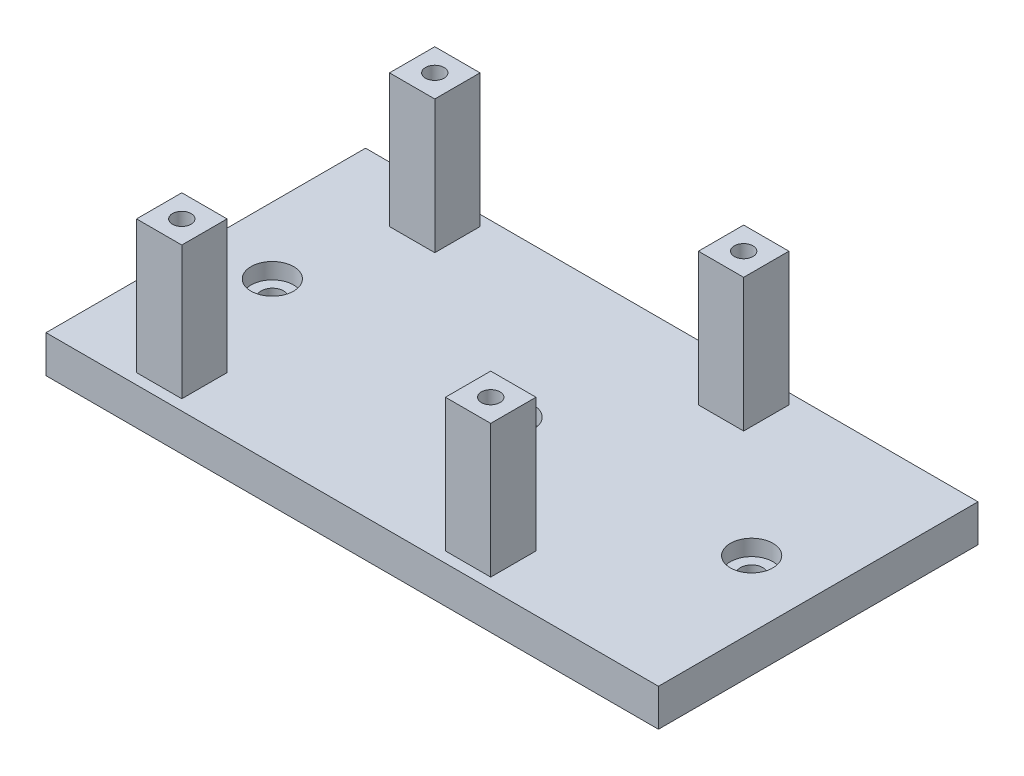
ISO-10303-21;
HEADER;
FILE_DESCRIPTION(('STEP AP214'),'2;1');
FILE_NAME('part.step','',(''),(''),'','','');
FILE_SCHEMA(('AUTOMOTIVE_DESIGN { 1 0 10303 214 1 1 1 1 }'));
ENDSEC;
DATA;
#1=APPLICATION_CONTEXT('core data for automotive mechanical design processes');
#2=APPLICATION_PROTOCOL_DEFINITION('international standard','automotive_design',2000,#1);
#3=PRODUCT_CONTEXT('',#1,'mechanical');
#4=PRODUCT('Part','Part','',(#3));
#5=PRODUCT_RELATED_PRODUCT_CATEGORY('part','',(#4));
#6=PRODUCT_DEFINITION_FORMATION('','',#4);
#7=PRODUCT_DEFINITION_CONTEXT('part definition',#1,'design');
#8=PRODUCT_DEFINITION('design','',#6,#7);
#9=PRODUCT_DEFINITION_SHAPE('','',#8);
#10=(LENGTH_UNIT() NAMED_UNIT(*) SI_UNIT(.MILLI.,.METRE.));
#11=(NAMED_UNIT(*) PLANE_ANGLE_UNIT() SI_UNIT($,.RADIAN.));
#12=(NAMED_UNIT(*) SI_UNIT($,.STERADIAN.) SOLID_ANGLE_UNIT());
#13=UNCERTAINTY_MEASURE_WITH_UNIT(LENGTH_MEASURE(1.E-05),#10,'distance_accuracy_value','');
#14=(GEOMETRIC_REPRESENTATION_CONTEXT(3) GLOBAL_UNCERTAINTY_ASSIGNED_CONTEXT((#13)) GLOBAL_UNIT_ASSIGNED_CONTEXT((#10,
#11,#12)) REPRESENTATION_CONTEXT('',''));
#15=CARTESIAN_POINT('',(0.,0.,0.));
#16=DIRECTION('',(0.,0.,1.));
#17=DIRECTION('',(1.,0.,0.));
#18=AXIS2_PLACEMENT_3D('',#15,#16,#17);
#19=CARTESIAN_POINT('',(0.,7.,0.));
#20=DIRECTION('',(0.,-1.,0.));
#21=DIRECTION('',(0.,0.,-1.));
#22=AXIS2_PLACEMENT_3D('',#19,#20,#21);
#23=PLANE('',#22);
#24=DIRECTION('',(-1.,0.,0.));
#25=VECTOR('',#24,1.);
#26=CARTESIAN_POINT('',(0.,7.,-10.5));
#27=LINE('',#26,#25);
#28=CARTESIAN_POINT('',(23.5,7.,-10.5));
#29=VERTEX_POINT('',#28);
#30=CARTESIAN_POINT('',(15.,7.,-10.5));
#31=VERTEX_POINT('',#30);
#32=EDGE_CURVE('E260',#29,#31,#27,.T.);
#33=ORIENTED_EDGE('',*,*,#32,.F.);
#34=DIRECTION('',(0.,0.,-1.));
#35=VECTOR('',#34,1.);
#36=CARTESIAN_POINT('',(23.5,7.,0.));
#37=LINE('',#36,#35);
#38=CARTESIAN_POINT('',(23.5,7.,-1.99999999999999));
#39=VERTEX_POINT('',#38);
#40=EDGE_CURVE('E266',#39,#29,#37,.T.);
#41=ORIENTED_EDGE('',*,*,#40,.F.);
#42=DIRECTION('',(1.,0.,0.));
#43=VECTOR('',#42,1.);
#44=CARTESIAN_POINT('',(0.,7.,-1.99999999999999));
#45=LINE('',#44,#43);
#46=CARTESIAN_POINT('',(15.,7.,-1.99999999999999));
#47=VERTEX_POINT('',#46);
#48=EDGE_CURVE('E283',#47,#39,#45,.T.);
#49=ORIENTED_EDGE('',*,*,#48,.F.);
#50=DIRECTION('',(0.,0.,1.));
#51=VECTOR('',#50,1.);
#52=CARTESIAN_POINT('',(15.,7.,0.));
#53=LINE('',#52,#51);
#54=EDGE_CURVE('E279',#31,#47,#53,.T.);
#55=ORIENTED_EDGE('',*,*,#54,.F.);
#56=EDGE_LOOP('',(#33,#41,#49,#55));
#57=FACE_BOUND('',#56,.T.);
#58=DIRECTION('',(-1.,0.,0.));
#59=VECTOR('',#58,1.);
#60=CARTESIAN_POINT('',(0.,7.,-49.5));
#61=LINE('',#60,#59);
#62=CARTESIAN_POINT('',(23.5,7.,-49.5));
#63=VERTEX_POINT('',#62);
#64=CARTESIAN_POINT('',(15.,7.,-49.5));
#65=VERTEX_POINT('',#64);
#66=EDGE_CURVE('E327',#63,#65,#61,.T.);
#67=ORIENTED_EDGE('',*,*,#66,.T.);
#68=DIRECTION('',(0.,0.,-1.));
#69=VECTOR('',#68,1.);
#70=CARTESIAN_POINT('',(15.,7.,0.));
#71=LINE('',#70,#69);
#72=CARTESIAN_POINT('',(15.,7.,-58.));
#73=VERTEX_POINT('',#72);
#74=EDGE_CURVE('E305',#65,#73,#71,.T.);
#75=ORIENTED_EDGE('',*,*,#74,.T.);
#76=DIRECTION('',(1.,0.,0.));
#77=VECTOR('',#76,1.);
#78=CARTESIAN_POINT('',(0.,7.,-58.));
#79=LINE('',#78,#77);
#80=CARTESIAN_POINT('',(23.5,7.,-58.));
#81=VERTEX_POINT('',#80);
#82=EDGE_CURVE('E311',#73,#81,#79,.T.);
#83=ORIENTED_EDGE('',*,*,#82,.T.);
#84=DIRECTION('',(0.,0.,1.));
#85=VECTOR('',#84,1.);
#86=CARTESIAN_POINT('',(23.5,7.,0.));
#87=LINE('',#86,#85);
#88=EDGE_CURVE('E331',#81,#63,#87,.T.);
#89=ORIENTED_EDGE('',*,*,#88,.T.);
#90=EDGE_LOOP('',(#67,#75,#83,#89));
#91=FACE_BOUND('',#90,.T.);
#92=CARTESIAN_POINT('',(12.5,7.,-30.));
#93=DIRECTION('',(0.,1.,0.));
#94=DIRECTION('',(0.,0.,1.));
#95=AXIS2_PLACEMENT_3D('',#92,#93,#94);
#96=CIRCLE('',#95,4.);
#97=CARTESIAN_POINT('',(12.5,7.,-26.));
#98=VERTEX_POINT('',#97);
#99=EDGE_CURVE('E356',#98,#98,#96,.T.);
#100=ORIENTED_EDGE('',*,*,#99,.F.);
#101=EDGE_LOOP('',(#100));
#102=FACE_BOUND('',#101,.T.);
#103=CARTESIAN_POINT('',(57.5,7.,-30.));
#104=DIRECTION('',(0.,1.,0.));
#105=DIRECTION('',(0.,0.,1.));
#106=AXIS2_PLACEMENT_3D('',#103,#104,#105);
#107=CIRCLE('',#106,4.);
#108=CARTESIAN_POINT('',(57.5,7.,-26.));
#109=VERTEX_POINT('',#108);
#110=EDGE_CURVE('E360',#109,#109,#107,.T.);
#111=ORIENTED_EDGE('',*,*,#110,.F.);
#112=EDGE_LOOP('',(#111));
#113=FACE_BOUND('',#112,.T.);
#114=CARTESIAN_POINT('',(102.5,7.,-30.));
#115=DIRECTION('',(0.,1.,0.));
#116=DIRECTION('',(0.,0.,1.));
#117=AXIS2_PLACEMENT_3D('',#114,#115,#116);
#118=CIRCLE('',#117,4.00000000000001);
#119=CARTESIAN_POINT('',(102.5,7.,-26.));
#120=VERTEX_POINT('',#119);
#121=EDGE_CURVE('E368',#120,#120,#118,.T.);
#122=ORIENTED_EDGE('',*,*,#121,.F.);
#123=EDGE_LOOP('',(#122));
#124=FACE_BOUND('',#123,.T.);
#125=DIRECTION('',(1.,0.,0.));
#126=VECTOR('',#125,1.);
#127=CARTESIAN_POINT('',(0.,7.,0.));
#128=LINE('',#127,#126);
#129=CARTESIAN_POINT('',(0.,7.,0.));
#130=VERTEX_POINT('',#129);
#131=CARTESIAN_POINT('',(115.,7.,0.));
#132=VERTEX_POINT('',#131);
#133=EDGE_CURVE('E388',#130,#132,#128,.T.);
#134=ORIENTED_EDGE('',*,*,#133,.T.);
#135=DIRECTION('',(0.,0.,-1.));
#136=VECTOR('',#135,1.);
#137=CARTESIAN_POINT('',(115.,7.,-60.));
#138=LINE('',#137,#136);
#139=CARTESIAN_POINT('',(115.,7.,-60.));
#140=VERTEX_POINT('',#139);
#141=EDGE_CURVE('E392',#132,#140,#138,.T.);
#142=ORIENTED_EDGE('',*,*,#141,.T.);
#143=DIRECTION('',(-1.,0.,0.));
#144=VECTOR('',#143,1.);
#145=CARTESIAN_POINT('',(0.,7.,-60.));
#146=LINE('',#145,#144);
#147=CARTESIAN_POINT('',(0.,7.,-60.));
#148=VERTEX_POINT('',#147);
#149=EDGE_CURVE('E396',#140,#148,#146,.T.);
#150=ORIENTED_EDGE('',*,*,#149,.T.);
#151=DIRECTION('',(0.,0.,1.));
#152=VECTOR('',#151,1.);
#153=CARTESIAN_POINT('',(0.,7.,0.));
#154=LINE('',#153,#152);
#155=EDGE_CURVE('E399',#148,#130,#154,.T.);
#156=ORIENTED_EDGE('',*,*,#155,.T.);
#157=EDGE_LOOP('',(#134,#142,#150,#156));
#158=FACE_BOUND('',#157,.T.);
#159=DIRECTION('',(0.,0.,-1.));
#160=VECTOR('',#159,1.);
#161=CARTESIAN_POINT('',(73.,7.,0.));
#162=LINE('',#161,#160);
#163=CARTESIAN_POINT('',(73.,7.,-49.5));
#164=VERTEX_POINT('',#163);
#165=CARTESIAN_POINT('',(73.,7.,-58.));
#166=VERTEX_POINT('',#165);
#167=EDGE_CURVE('E214',#164,#166,#162,.T.);
#168=ORIENTED_EDGE('',*,*,#167,.T.);
#169=DIRECTION('',(1.,0.,0.));
#170=VECTOR('',#169,1.);
#171=CARTESIAN_POINT('',(0.,7.,-58.));
#172=LINE('',#171,#170);
#173=CARTESIAN_POINT('',(81.5,7.,-58.));
#174=VERTEX_POINT('',#173);
#175=EDGE_CURVE('E209',#166,#174,#172,.T.);
#176=ORIENTED_EDGE('',*,*,#175,.T.);
#177=DIRECTION('',(0.,0.,1.));
#178=VECTOR('',#177,1.);
#179=CARTESIAN_POINT('',(81.5,7.,0.));
#180=LINE('',#179,#178);
#181=CARTESIAN_POINT('',(81.5,7.,-49.5));
#182=VERTEX_POINT('',#181);
#183=EDGE_CURVE('E225',#174,#182,#180,.T.);
#184=ORIENTED_EDGE('',*,*,#183,.T.);
#185=DIRECTION('',(-1.,0.,0.));
#186=VECTOR('',#185,1.);
#187=CARTESIAN_POINT('',(0.,7.,-49.5));
#188=LINE('',#187,#186);
#189=EDGE_CURVE('E241',#182,#164,#188,.T.);
#190=ORIENTED_EDGE('',*,*,#189,.T.);
#191=EDGE_LOOP('',(#168,#176,#184,#190));
#192=FACE_BOUND('',#191,.T.);
#193=DIRECTION('',(0.,0.,1.));
#194=VECTOR('',#193,1.);
#195=CARTESIAN_POINT('',(73.,7.,-1.19185707055348E-13));
#196=LINE('',#195,#194);
#197=CARTESIAN_POINT('',(73.,7.,-10.5));
#198=VERTEX_POINT('',#197);
#199=CARTESIAN_POINT('',(73.,7.,-2.00000000000001));
#200=VERTEX_POINT('',#199);
#201=EDGE_CURVE('E207',#198,#200,#196,.T.);
#202=ORIENTED_EDGE('',*,*,#201,.F.);
#203=DIRECTION('',(-1.,0.,0.));
#204=VECTOR('',#203,1.);
#205=CARTESIAN_POINT('',(0.,7.,-10.5));
#206=LINE('',#205,#204);
#207=CARTESIAN_POINT('',(81.5,7.,-10.5));
#208=VERTEX_POINT('',#207);
#209=EDGE_CURVE('E204',#208,#198,#206,.T.);
#210=ORIENTED_EDGE('',*,*,#209,.F.);
#211=DIRECTION('',(0.,0.,-1.));
#212=VECTOR('',#211,1.);
#213=CARTESIAN_POINT('',(81.5,7.,0.));
#214=LINE('',#213,#212);
#215=CARTESIAN_POINT('',(81.5,7.,-2.00000000000001));
#216=VERTEX_POINT('',#215);
#217=EDGE_CURVE('E68',#216,#208,#214,.T.);
#218=ORIENTED_EDGE('',*,*,#217,.F.);
#219=DIRECTION('',(1.,0.,0.));
#220=VECTOR('',#219,1.);
#221=CARTESIAN_POINT('',(0.,7.,-2.00000000000001));
#222=LINE('',#221,#220);
#223=EDGE_CURVE('E63',#200,#216,#222,.T.);
#224=ORIENTED_EDGE('',*,*,#223,.F.);
#225=EDGE_LOOP('',(#202,#210,#218,#224));
#226=FACE_BOUND('',#225,.T.);
#227=ADVANCED_FACE('F45',(#57,#91,#102,#113,#124,#158,#192,#226),#23,.F.);
#228=CARTESIAN_POINT('',(57.5,7.,-30.));
#229=DIRECTION('',(0.,-1.,0.));
#230=DIRECTION('',(0.,0.,-1.));
#231=AXIS2_PLACEMENT_3D('',#228,#229,#230);
#232=CYLINDRICAL_SURFACE('',#231,2.1);
#233=CARTESIAN_POINT('',(57.5,0.,-30.));
#234=DIRECTION('',(0.,1.,0.));
#235=DIRECTION('',(0.,0.,1.));
#236=AXIS2_PLACEMENT_3D('',#233,#234,#235);
#237=CIRCLE('',#236,2.1);
#238=CARTESIAN_POINT('',(57.5,0.,-27.9));
#239=VERTEX_POINT('',#238);
#240=EDGE_CURVE('E383',#239,#239,#237,.T.);
#241=ORIENTED_EDGE('',*,*,#240,.F.);
#242=EDGE_LOOP('',(#241));
#243=FACE_BOUND('',#242,.T.);
#244=CARTESIAN_POINT('',(57.5,4.,-30.));
#245=DIRECTION('',(0.,1.,0.));
#246=DIRECTION('',(0.,0.,1.));
#247=AXIS2_PLACEMENT_3D('',#244,#245,#246);
#248=CIRCLE('',#247,2.1);
#249=CARTESIAN_POINT('',(57.5,4.,-27.9));
#250=VERTEX_POINT('',#249);
#251=EDGE_CURVE('E49',#250,#250,#248,.T.);
#252=ORIENTED_EDGE('',*,*,#251,.T.);
#253=EDGE_LOOP('',(#252));
#254=FACE_BOUND('',#253,.T.);
#255=ADVANCED_FACE('F435',(#243,#254),#232,.F.);
#256=CARTESIAN_POINT('',(12.5,7.,-30.));
#257=DIRECTION('',(0.,-1.,0.));
#258=DIRECTION('',(0.,0.,-1.));
#259=AXIS2_PLACEMENT_3D('',#256,#257,#258);
#260=CYLINDRICAL_SURFACE('',#259,2.1);
#261=CARTESIAN_POINT('',(12.5,0.,-30.));
#262=DIRECTION('',(0.,1.,0.));
#263=DIRECTION('',(0.,0.,1.));
#264=AXIS2_PLACEMENT_3D('',#261,#262,#263);
#265=CIRCLE('',#264,2.1);
#266=CARTESIAN_POINT('',(12.5,0.,-27.9));
#267=VERTEX_POINT('',#266);
#268=EDGE_CURVE('E379',#267,#267,#265,.T.);
#269=ORIENTED_EDGE('',*,*,#268,.F.);
#270=EDGE_LOOP('',(#269));
#271=FACE_BOUND('',#270,.T.);
#272=CARTESIAN_POINT('',(12.5,4.,-30.));
#273=DIRECTION('',(0.,1.,0.));
#274=DIRECTION('',(0.,0.,1.));
#275=AXIS2_PLACEMENT_3D('',#272,#273,#274);
#276=CIRCLE('',#275,2.1);
#277=CARTESIAN_POINT('',(12.5,4.,-27.9));
#278=VERTEX_POINT('',#277);
#279=EDGE_CURVE('E426',#278,#278,#276,.T.);
#280=ORIENTED_EDGE('',*,*,#279,.T.);
#281=EDGE_LOOP('',(#280));
#282=FACE_BOUND('',#281,.T.);
#283=ADVANCED_FACE('F619',(#271,#282),#260,.F.);
#284=CARTESIAN_POINT('',(102.5,7.,-30.));
#285=DIRECTION('',(0.,-1.,0.));
#286=DIRECTION('',(0.,0.,-1.));
#287=AXIS2_PLACEMENT_3D('',#284,#285,#286);
#288=CYLINDRICAL_SURFACE('',#287,2.09999999999999);
#289=CARTESIAN_POINT('',(102.5,0.,-30.));
#290=DIRECTION('',(0.,1.,0.));
#291=DIRECTION('',(0.,0.,-1.));
#292=AXIS2_PLACEMENT_3D('',#289,#290,#291);
#293=CIRCLE('',#292,2.09999999999999);
#294=CARTESIAN_POINT('',(102.5,0.,-32.1));
#295=VERTEX_POINT('',#294);
#296=EDGE_CURVE('E375',#295,#295,#293,.T.);
#297=ORIENTED_EDGE('',*,*,#296,.F.);
#298=EDGE_LOOP('',(#297));
#299=FACE_BOUND('',#298,.T.);
#300=CARTESIAN_POINT('',(102.5,4.,-30.));
#301=DIRECTION('',(0.,1.,0.));
#302=DIRECTION('',(0.,0.,1.));
#303=AXIS2_PLACEMENT_3D('',#300,#301,#302);
#304=CIRCLE('',#303,2.09999999999999);
#305=CARTESIAN_POINT('',(102.5,4.,-27.9));
#306=VERTEX_POINT('',#305);
#307=EDGE_CURVE('E355',#306,#306,#304,.T.);
#308=ORIENTED_EDGE('',*,*,#307,.T.);
#309=EDGE_LOOP('',(#308));
#310=FACE_BOUND('',#309,.T.);
#311=ADVANCED_FACE('F615',(#299,#310),#288,.F.);
#312=CARTESIAN_POINT('',(0.,0.,0.));
#313=DIRECTION('',(0.,-1.,0.));
#314=DIRECTION('',(0.,0.,-1.));
#315=AXIS2_PLACEMENT_3D('',#312,#313,#314);
#316=PLANE('',#315);
#317=ORIENTED_EDGE('',*,*,#268,.T.);
#318=EDGE_LOOP('',(#317));
#319=FACE_BOUND('',#318,.T.);
#320=DIRECTION('',(1.,0.,0.));
#321=VECTOR('',#320,1.);
#322=CARTESIAN_POINT('',(0.,0.,0.));
#323=LINE('',#322,#321);
#324=CARTESIAN_POINT('',(0.,0.,0.));
#325=VERTEX_POINT('',#324);
#326=CARTESIAN_POINT('',(115.,0.,0.));
#327=VERTEX_POINT('',#326);
#328=EDGE_CURVE('E387',#325,#327,#323,.T.);
#329=ORIENTED_EDGE('',*,*,#328,.F.);
#330=DIRECTION('',(0.,0.,1.));
#331=VECTOR('',#330,1.);
#332=CARTESIAN_POINT('',(0.,0.,0.));
#333=LINE('',#332,#331);
#334=CARTESIAN_POINT('',(0.,0.,-60.));
#335=VERTEX_POINT('',#334);
#336=EDGE_CURVE('E393',#335,#325,#333,.T.);
#337=ORIENTED_EDGE('',*,*,#336,.F.);
#338=DIRECTION('',(-1.,0.,0.));
#339=VECTOR('',#338,1.);
#340=CARTESIAN_POINT('',(0.,0.,-60.));
#341=LINE('',#340,#339);
#342=CARTESIAN_POINT('',(115.,0.,-60.));
#343=VERTEX_POINT('',#342);
#344=EDGE_CURVE('E409',#343,#335,#341,.T.);
#345=ORIENTED_EDGE('',*,*,#344,.F.);
#346=DIRECTION('',(0.,0.,-1.));
#347=VECTOR('',#346,1.);
#348=CARTESIAN_POINT('',(115.,0.,-60.));
#349=LINE('',#348,#347);
#350=EDGE_CURVE('E406',#327,#343,#349,.T.);
#351=ORIENTED_EDGE('',*,*,#350,.F.);
#352=EDGE_LOOP('',(#329,#337,#345,#351));
#353=FACE_BOUND('',#352,.T.);
#354=ORIENTED_EDGE('',*,*,#240,.T.);
#355=EDGE_LOOP('',(#354));
#356=FACE_BOUND('',#355,.T.);
#357=ORIENTED_EDGE('',*,*,#296,.T.);
#358=EDGE_LOOP('',(#357));
#359=FACE_BOUND('',#358,.T.);
#360=ADVANCED_FACE('F618',(#319,#353,#356,#359),#316,.T.);
#361=CARTESIAN_POINT('',(0.,7.,0.));
#362=DIRECTION('',(0.,0.,-1.));
#363=DIRECTION('',(-1.,0.,0.));
#364=AXIS2_PLACEMENT_3D('',#361,#362,#363);
#365=PLANE('',#364);
#366=ORIENTED_EDGE('',*,*,#328,.T.);
#367=DIRECTION('',(0.,-1.,0.));
#368=VECTOR('',#367,1.);
#369=CARTESIAN_POINT('',(115.,7.,0.));
#370=LINE('',#369,#368);
#371=EDGE_CURVE('E11',#132,#327,#370,.T.);
#372=ORIENTED_EDGE('',*,*,#371,.F.);
#373=ORIENTED_EDGE('',*,*,#133,.F.);
#374=DIRECTION('',(0.,-1.,0.));
#375=VECTOR('',#374,1.);
#376=CARTESIAN_POINT('',(0.,7.,0.));
#377=LINE('',#376,#375);
#378=EDGE_CURVE('E402',#130,#325,#377,.T.);
#379=ORIENTED_EDGE('',*,*,#378,.T.);
#380=EDGE_LOOP('',(#366,#372,#373,#379));
#381=FACE_BOUND('',#380,.T.);
#382=ADVANCED_FACE('F47',(#381),#365,.F.);
#383=CARTESIAN_POINT('',(115.,7.,-60.));
#384=DIRECTION('',(-1.,0.,0.));
#385=DIRECTION('',(0.,0.,1.));
#386=AXIS2_PLACEMENT_3D('',#383,#384,#385);
#387=PLANE('',#386);
#388=ORIENTED_EDGE('',*,*,#350,.T.);
#389=DIRECTION('',(0.,-1.,0.));
#390=VECTOR('',#389,1.);
#391=CARTESIAN_POINT('',(115.,7.,-60.));
#392=LINE('',#391,#390);
#393=EDGE_CURVE('E55',#140,#343,#392,.T.);
#394=ORIENTED_EDGE('',*,*,#393,.F.);
#395=ORIENTED_EDGE('',*,*,#141,.F.);
#396=ORIENTED_EDGE('',*,*,#371,.T.);
#397=EDGE_LOOP('',(#388,#394,#395,#396));
#398=FACE_BOUND('',#397,.T.);
#399=ADVANCED_FACE('F635',(#398),#387,.F.);
#400=CARTESIAN_POINT('',(0.,7.,-60.));
#401=DIRECTION('',(0.,0.,1.));
#402=DIRECTION('',(1.,0.,0.));
#403=AXIS2_PLACEMENT_3D('',#400,#401,#402);
#404=PLANE('',#403);
#405=ORIENTED_EDGE('',*,*,#344,.T.);
#406=DIRECTION('',(0.,-1.,0.));
#407=VECTOR('',#406,1.);
#408=CARTESIAN_POINT('',(0.,7.,-60.));
#409=LINE('',#408,#407);
#410=EDGE_CURVE('E417',#148,#335,#409,.T.);
#411=ORIENTED_EDGE('',*,*,#410,.F.);
#412=ORIENTED_EDGE('',*,*,#149,.F.);
#413=ORIENTED_EDGE('',*,*,#393,.T.);
#414=EDGE_LOOP('',(#405,#411,#412,#413));
#415=FACE_BOUND('',#414,.T.);
#416=ADVANCED_FACE('F632',(#415),#404,.F.);
#417=CARTESIAN_POINT('',(0.,7.,0.));
#418=DIRECTION('',(1.,0.,0.));
#419=DIRECTION('',(0.,0.,-1.));
#420=AXIS2_PLACEMENT_3D('',#417,#418,#419);
#421=PLANE('',#420);
#422=ORIENTED_EDGE('',*,*,#336,.T.);
#423=ORIENTED_EDGE('',*,*,#378,.F.);
#424=ORIENTED_EDGE('',*,*,#155,.F.);
#425=ORIENTED_EDGE('',*,*,#410,.T.);
#426=EDGE_LOOP('',(#422,#423,#424,#425));
#427=FACE_BOUND('',#426,.T.);
#428=ADVANCED_FACE('F610',(#427),#421,.F.);
#429=CARTESIAN_POINT('',(102.5,4.,-30.));
#430=DIRECTION('',(0.,1.,0.));
#431=DIRECTION('',(0.,0.,1.));
#432=AXIS2_PLACEMENT_3D('',#429,#430,#431);
#433=CYLINDRICAL_SURFACE('',#432,4.00000000000001);
#434=CARTESIAN_POINT('',(102.5,4.,-30.));
#435=DIRECTION('',(0.,1.,0.));
#436=DIRECTION('',(0.,0.,1.));
#437=AXIS2_PLACEMENT_3D('',#434,#435,#436);
#438=CIRCLE('',#437,4.00000000000001);
#439=CARTESIAN_POINT('',(102.5,4.,-26.));
#440=VERTEX_POINT('',#439);
#441=EDGE_CURVE('E350',#440,#440,#438,.T.);
#442=ORIENTED_EDGE('',*,*,#441,.F.);
#443=EDGE_LOOP('',(#442));
#444=FACE_BOUND('',#443,.T.);
#445=ORIENTED_EDGE('',*,*,#121,.T.);
#446=EDGE_LOOP('',(#445));
#447=FACE_BOUND('',#446,.T.);
#448=ADVANCED_FACE('F607',(#444,#447),#433,.F.);
#449=CARTESIAN_POINT('',(102.5,4.,-30.));
#450=DIRECTION('',(0.,1.,0.));
#451=DIRECTION('',(0.,0.,1.));
#452=AXIS2_PLACEMENT_3D('',#449,#450,#451);
#453=PLANE('',#452);
#454=ORIENTED_EDGE('',*,*,#307,.F.);
#455=EDGE_LOOP('',(#454));
#456=FACE_BOUND('',#455,.T.);
#457=ORIENTED_EDGE('',*,*,#441,.T.);
#458=EDGE_LOOP('',(#457));
#459=FACE_BOUND('',#458,.T.);
#460=ADVANCED_FACE('F604',(#456,#459),#453,.T.);
#461=CARTESIAN_POINT('',(12.5,4.,-30.));
#462=DIRECTION('',(0.,1.,0.));
#463=DIRECTION('',(0.,0.,1.));
#464=AXIS2_PLACEMENT_3D('',#461,#462,#463);
#465=CYLINDRICAL_SURFACE('',#464,4.);
#466=CARTESIAN_POINT('',(12.5,4.,-30.));
#467=DIRECTION('',(0.,1.,0.));
#468=DIRECTION('',(0.,0.,1.));
#469=AXIS2_PLACEMENT_3D('',#466,#467,#468);
#470=CIRCLE('',#469,4.);
#471=CARTESIAN_POINT('',(12.5,4.,-26.));
#472=VERTEX_POINT('',#471);
#473=EDGE_CURVE('E351',#472,#472,#470,.T.);
#474=ORIENTED_EDGE('',*,*,#473,.F.);
#475=EDGE_LOOP('',(#474));
#476=FACE_BOUND('',#475,.T.);
#477=ORIENTED_EDGE('',*,*,#99,.T.);
#478=EDGE_LOOP('',(#477));
#479=FACE_BOUND('',#478,.T.);
#480=ADVANCED_FACE('F601',(#476,#479),#465,.F.);
#481=CARTESIAN_POINT('',(12.5,4.,-30.));
#482=DIRECTION('',(0.,1.,0.));
#483=DIRECTION('',(0.,0.,1.));
#484=AXIS2_PLACEMENT_3D('',#481,#482,#483);
#485=PLANE('',#484);
#486=ORIENTED_EDGE('',*,*,#279,.F.);
#487=EDGE_LOOP('',(#486));
#488=FACE_BOUND('',#487,.T.);
#489=ORIENTED_EDGE('',*,*,#473,.T.);
#490=EDGE_LOOP('',(#489));
#491=FACE_BOUND('',#490,.T.);
#492=ADVANCED_FACE('F447',(#488,#491),#485,.T.);
#493=CARTESIAN_POINT('',(57.5,4.,-30.));
#494=DIRECTION('',(0.,1.,0.));
#495=DIRECTION('',(0.,0.,1.));
#496=AXIS2_PLACEMENT_3D('',#493,#494,#495);
#497=CYLINDRICAL_SURFACE('',#496,4.);
#498=CARTESIAN_POINT('',(57.5,4.,-30.));
#499=DIRECTION('',(0.,1.,0.));
#500=DIRECTION('',(0.,0.,1.));
#501=AXIS2_PLACEMENT_3D('',#498,#499,#500);
#502=CIRCLE('',#501,4.);
#503=CARTESIAN_POINT('',(57.5,4.,-26.));
#504=VERTEX_POINT('',#503);
#505=EDGE_CURVE('E364',#504,#504,#502,.T.);
#506=ORIENTED_EDGE('',*,*,#505,.F.);
#507=EDGE_LOOP('',(#506));
#508=FACE_BOUND('',#507,.T.);
#509=ORIENTED_EDGE('',*,*,#110,.T.);
#510=EDGE_LOOP('',(#509));
#511=FACE_BOUND('',#510,.T.);
#512=ADVANCED_FACE('F441',(#508,#511),#497,.F.);
#513=CARTESIAN_POINT('',(57.5,4.,-30.));
#514=DIRECTION('',(0.,1.,0.));
#515=DIRECTION('',(0.,0.,1.));
#516=AXIS2_PLACEMENT_3D('',#513,#514,#515);
#517=PLANE('',#516);
#518=ORIENTED_EDGE('',*,*,#251,.F.);
#519=EDGE_LOOP('',(#518));
#520=FACE_BOUND('',#519,.T.);
#521=ORIENTED_EDGE('',*,*,#505,.T.);
#522=EDGE_LOOP('',(#521));
#523=FACE_BOUND('',#522,.T.);
#524=ADVANCED_FACE('F437',(#520,#523),#517,.T.);
#525=CARTESIAN_POINT('',(15.,32.,0.));
#526=DIRECTION('',(-1.,0.,0.));
#527=DIRECTION('',(0.,0.,1.));
#528=AXIS2_PLACEMENT_3D('',#525,#526,#527);
#529=PLANE('',#528);
#530=ORIENTED_EDGE('',*,*,#74,.F.);
#531=DIRECTION('',(0.,-1.,0.));
#532=VECTOR('',#531,1.);
#533=CARTESIAN_POINT('',(15.,32.,-49.5));
#534=LINE('',#533,#532);
#535=CARTESIAN_POINT('',(15.,32.,-49.5));
#536=VERTEX_POINT('',#535);
#537=EDGE_CURVE('E347',#536,#65,#534,.T.);
#538=ORIENTED_EDGE('',*,*,#537,.F.);
#539=DIRECTION('',(0.,0.,-1.));
#540=VECTOR('',#539,1.);
#541=CARTESIAN_POINT('',(15.,32.,0.));
#542=LINE('',#541,#540);
#543=CARTESIAN_POINT('',(15.,32.,-58.));
#544=VERTEX_POINT('',#543);
#545=EDGE_CURVE('E306',#536,#544,#542,.T.);
#546=ORIENTED_EDGE('',*,*,#545,.T.);
#547=DIRECTION('',(0.,-1.,0.));
#548=VECTOR('',#547,1.);
#549=CARTESIAN_POINT('',(15.,32.,-58.));
#550=LINE('',#549,#548);
#551=EDGE_CURVE('E323',#544,#73,#550,.T.);
#552=ORIENTED_EDGE('',*,*,#551,.T.);
#553=EDGE_LOOP('',(#530,#538,#546,#552));
#554=FACE_BOUND('',#553,.T.);
#555=ADVANCED_FACE('F440',(#554),#529,.T.);
#556=CARTESIAN_POINT('',(0.,32.,-49.5));
#557=DIRECTION('',(0.,0.,1.));
#558=DIRECTION('',(1.,0.,0.));
#559=AXIS2_PLACEMENT_3D('',#556,#557,#558);
#560=PLANE('',#559);
#561=ORIENTED_EDGE('',*,*,#66,.F.);
#562=DIRECTION('',(0.,-1.,0.));
#563=VECTOR('',#562,1.);
#564=CARTESIAN_POINT('',(23.5,32.,-49.5));
#565=LINE('',#564,#563);
#566=CARTESIAN_POINT('',(23.5,32.,-49.5));
#567=VERTEX_POINT('',#566);
#568=EDGE_CURVE('E344',#567,#63,#565,.T.);
#569=ORIENTED_EDGE('',*,*,#568,.F.);
#570=DIRECTION('',(-1.,0.,0.));
#571=VECTOR('',#570,1.);
#572=CARTESIAN_POINT('',(0.,32.,-49.5));
#573=LINE('',#572,#571);
#574=EDGE_CURVE('E310',#567,#536,#573,.T.);
#575=ORIENTED_EDGE('',*,*,#574,.T.);
#576=ORIENTED_EDGE('',*,*,#537,.T.);
#577=EDGE_LOOP('',(#561,#569,#575,#576));
#578=FACE_BOUND('',#577,.T.);
#579=ADVANCED_FACE('F591',(#578),#560,.T.);
#580=CARTESIAN_POINT('',(23.5,32.,0.));
#581=DIRECTION('',(1.,0.,0.));
#582=DIRECTION('',(0.,0.,-1.));
#583=AXIS2_PLACEMENT_3D('',#580,#581,#582);
#584=PLANE('',#583);
#585=ORIENTED_EDGE('',*,*,#88,.F.);
#586=DIRECTION('',(0.,-1.,0.));
#587=VECTOR('',#586,1.);
#588=CARTESIAN_POINT('',(23.5,32.,-58.));
#589=LINE('',#588,#587);
#590=CARTESIAN_POINT('',(23.5,32.,-58.));
#591=VERTEX_POINT('',#590);
#592=EDGE_CURVE('E340',#591,#81,#589,.T.);
#593=ORIENTED_EDGE('',*,*,#592,.F.);
#594=DIRECTION('',(0.,0.,1.));
#595=VECTOR('',#594,1.);
#596=CARTESIAN_POINT('',(23.5,32.,0.));
#597=LINE('',#596,#595);
#598=EDGE_CURVE('E315',#591,#567,#597,.T.);
#599=ORIENTED_EDGE('',*,*,#598,.T.);
#600=ORIENTED_EDGE('',*,*,#568,.T.);
#601=EDGE_LOOP('',(#585,#593,#599,#600));
#602=FACE_BOUND('',#601,.T.);
#603=ADVANCED_FACE('F587',(#602),#584,.T.);
#604=CARTESIAN_POINT('',(0.,32.,-58.));
#605=DIRECTION('',(0.,0.,-1.));
#606=DIRECTION('',(-1.,0.,0.));
#607=AXIS2_PLACEMENT_3D('',#604,#605,#606);
#608=PLANE('',#607);
#609=ORIENTED_EDGE('',*,*,#82,.F.);
#610=ORIENTED_EDGE('',*,*,#551,.F.);
#611=DIRECTION('',(1.,0.,0.));
#612=VECTOR('',#611,1.);
#613=CARTESIAN_POINT('',(0.,32.,-58.));
#614=LINE('',#613,#612);
#615=EDGE_CURVE('E319',#544,#591,#614,.T.);
#616=ORIENTED_EDGE('',*,*,#615,.T.);
#617=ORIENTED_EDGE('',*,*,#592,.T.);
#618=EDGE_LOOP('',(#609,#610,#616,#617));
#619=FACE_BOUND('',#618,.T.);
#620=ADVANCED_FACE('F583',(#619),#608,.T.);
#621=CARTESIAN_POINT('',(0.,32.,0.));
#622=DIRECTION('',(0.,1.,0.));
#623=DIRECTION('',(0.,0.,1.));
#624=AXIS2_PLACEMENT_3D('',#621,#622,#623);
#625=PLANE('',#624);
#626=CARTESIAN_POINT('',(19.25,32.,-53.75));
#627=DIRECTION('',(0.,1.,0.));
#628=DIRECTION('',(0.,0.,1.));
#629=AXIS2_PLACEMENT_3D('',#626,#627,#628);
#630=CIRCLE('',#629,1.75);
#631=CARTESIAN_POINT('',(19.25,32.,-52.));
#632=VERTEX_POINT('',#631);
#633=EDGE_CURVE('E484',#632,#632,#630,.T.);
#634=ORIENTED_EDGE('',*,*,#633,.F.);
#635=EDGE_LOOP('',(#634));
#636=FACE_BOUND('',#635,.T.);
#637=ORIENTED_EDGE('',*,*,#545,.F.);
#638=ORIENTED_EDGE('',*,*,#574,.F.);
#639=ORIENTED_EDGE('',*,*,#598,.F.);
#640=ORIENTED_EDGE('',*,*,#615,.F.);
#641=EDGE_LOOP('',(#637,#638,#639,#640));
#642=FACE_BOUND('',#641,.T.);
#643=ADVANCED_FACE('F579',(#636,#642),#625,.T.);
#644=CARTESIAN_POINT('',(0.,32.,-10.5));
#645=DIRECTION('',(0.,0.,1.));
#646=DIRECTION('',(1.,0.,0.));
#647=AXIS2_PLACEMENT_3D('',#644,#645,#646);
#648=PLANE('',#647);
#649=ORIENTED_EDGE('',*,*,#32,.T.);
#650=DIRECTION('',(0.,-1.,0.));
#651=VECTOR('',#650,1.);
#652=CARTESIAN_POINT('',(15.,32.,-10.5));
#653=LINE('',#652,#651);
#654=CARTESIAN_POINT('',(15.,32.,-10.5));
#655=VERTEX_POINT('',#654);
#656=EDGE_CURVE('E301',#655,#31,#653,.T.);
#657=ORIENTED_EDGE('',*,*,#656,.F.);
#658=DIRECTION('',(-1.,0.,0.));
#659=VECTOR('',#658,1.);
#660=CARTESIAN_POINT('',(0.,32.,-10.5));
#661=LINE('',#660,#659);
#662=CARTESIAN_POINT('',(23.5,32.,-10.5));
#663=VERTEX_POINT('',#662);
#664=EDGE_CURVE('E261',#663,#655,#661,.T.);
#665=ORIENTED_EDGE('',*,*,#664,.F.);
#666=DIRECTION('',(0.,-1.,0.));
#667=VECTOR('',#666,1.);
#668=CARTESIAN_POINT('',(23.5,32.,-10.5));
#669=LINE('',#668,#667);
#670=EDGE_CURVE('E275',#663,#29,#669,.T.);
#671=ORIENTED_EDGE('',*,*,#670,.T.);
#672=EDGE_LOOP('',(#649,#657,#665,#671));
#673=FACE_BOUND('',#672,.T.);
#674=ADVANCED_FACE('F575',(#673),#648,.F.);
#675=CARTESIAN_POINT('',(15.,32.,0.));
#676=DIRECTION('',(1.,0.,0.));
#677=DIRECTION('',(0.,0.,-1.));
#678=AXIS2_PLACEMENT_3D('',#675,#676,#677);
#679=PLANE('',#678);
#680=ORIENTED_EDGE('',*,*,#54,.T.);
#681=DIRECTION('',(0.,-1.,0.));
#682=VECTOR('',#681,1.);
#683=CARTESIAN_POINT('',(15.,32.,-1.99999999999999));
#684=LINE('',#683,#682);
#685=CARTESIAN_POINT('',(15.,32.,-1.99999999999999));
#686=VERTEX_POINT('',#685);
#687=EDGE_CURVE('E297',#686,#47,#684,.T.);
#688=ORIENTED_EDGE('',*,*,#687,.F.);
#689=DIRECTION('',(0.,0.,1.));
#690=VECTOR('',#689,1.);
#691=CARTESIAN_POINT('',(15.,32.,0.));
#692=LINE('',#691,#690);
#693=EDGE_CURVE('E265',#655,#686,#692,.T.);
#694=ORIENTED_EDGE('',*,*,#693,.F.);
#695=ORIENTED_EDGE('',*,*,#656,.T.);
#696=EDGE_LOOP('',(#680,#688,#694,#695));
#697=FACE_BOUND('',#696,.T.);
#698=ADVANCED_FACE('F571',(#697),#679,.F.);
#699=CARTESIAN_POINT('',(0.,32.,-1.99999999999999));
#700=DIRECTION('',(0.,0.,-1.));
#701=DIRECTION('',(-1.,0.,0.));
#702=AXIS2_PLACEMENT_3D('',#699,#700,#701);
#703=PLANE('',#702);
#704=ORIENTED_EDGE('',*,*,#48,.T.);
#705=DIRECTION('',(0.,-1.,0.));
#706=VECTOR('',#705,1.);
#707=CARTESIAN_POINT('',(23.5,32.,-1.99999999999999));
#708=LINE('',#707,#706);
#709=CARTESIAN_POINT('',(23.5,32.,-1.99999999999999));
#710=VERTEX_POINT('',#709);
#711=EDGE_CURVE('E293',#710,#39,#708,.T.);
#712=ORIENTED_EDGE('',*,*,#711,.F.);
#713=DIRECTION('',(1.,0.,0.));
#714=VECTOR('',#713,1.);
#715=CARTESIAN_POINT('',(0.,32.,-1.99999999999999));
#716=LINE('',#715,#714);
#717=EDGE_CURVE('E269',#686,#710,#716,.T.);
#718=ORIENTED_EDGE('',*,*,#717,.F.);
#719=ORIENTED_EDGE('',*,*,#687,.T.);
#720=EDGE_LOOP('',(#704,#712,#718,#719));
#721=FACE_BOUND('',#720,.T.);
#722=ADVANCED_FACE('F567',(#721),#703,.F.);
#723=CARTESIAN_POINT('',(23.5,32.,0.));
#724=DIRECTION('',(-1.,0.,0.));
#725=DIRECTION('',(0.,0.,1.));
#726=AXIS2_PLACEMENT_3D('',#723,#724,#725);
#727=PLANE('',#726);
#728=ORIENTED_EDGE('',*,*,#40,.T.);
#729=ORIENTED_EDGE('',*,*,#670,.F.);
#730=DIRECTION('',(0.,0.,-1.));
#731=VECTOR('',#730,1.);
#732=CARTESIAN_POINT('',(23.5,32.,0.));
#733=LINE('',#732,#731);
#734=EDGE_CURVE('E272',#710,#663,#733,.T.);
#735=ORIENTED_EDGE('',*,*,#734,.F.);
#736=ORIENTED_EDGE('',*,*,#711,.T.);
#737=EDGE_LOOP('',(#728,#729,#735,#736));
#738=FACE_BOUND('',#737,.T.);
#739=ADVANCED_FACE('F563',(#738),#727,.F.);
#740=CARTESIAN_POINT('',(0.,32.,0.));
#741=DIRECTION('',(0.,1.,0.));
#742=DIRECTION('',(0.,0.,1.));
#743=AXIS2_PLACEMENT_3D('',#740,#741,#742);
#744=PLANE('',#743);
#745=CARTESIAN_POINT('',(19.25,32.,-6.24999999999999));
#746=DIRECTION('',(0.,1.,0.));
#747=DIRECTION('',(0.,0.,1.));
#748=AXIS2_PLACEMENT_3D('',#745,#746,#747);
#749=CIRCLE('',#748,1.75);
#750=CARTESIAN_POINT('',(19.25,32.,-4.49999999999999));
#751=VERTEX_POINT('',#750);
#752=EDGE_CURVE('E496',#751,#751,#749,.T.);
#753=ORIENTED_EDGE('',*,*,#752,.F.);
#754=EDGE_LOOP('',(#753));
#755=FACE_BOUND('',#754,.T.);
#756=ORIENTED_EDGE('',*,*,#664,.T.);
#757=ORIENTED_EDGE('',*,*,#693,.T.);
#758=ORIENTED_EDGE('',*,*,#717,.T.);
#759=ORIENTED_EDGE('',*,*,#734,.T.);
#760=EDGE_LOOP('',(#756,#757,#758,#759));
#761=FACE_BOUND('',#760,.T.);
#762=ADVANCED_FACE('F559',(#755,#761),#744,.T.);
#763=CARTESIAN_POINT('',(0.,32.,-58.));
#764=DIRECTION('',(0.,0.,-1.));
#765=DIRECTION('',(-1.,0.,0.));
#766=AXIS2_PLACEMENT_3D('',#763,#764,#765);
#767=PLANE('',#766);
#768=ORIENTED_EDGE('',*,*,#175,.F.);
#769=DIRECTION('',(0.,-1.,0.));
#770=VECTOR('',#769,1.);
#771=CARTESIAN_POINT('',(73.,32.,-58.));
#772=LINE('',#771,#770);
#773=CARTESIAN_POINT('',(73.,32.,-58.));
#774=VERTEX_POINT('',#773);
#775=EDGE_CURVE('E257',#774,#166,#772,.T.);
#776=ORIENTED_EDGE('',*,*,#775,.F.);
#777=DIRECTION('',(1.,0.,0.));
#778=VECTOR('',#777,1.);
#779=CARTESIAN_POINT('',(0.,32.,-58.));
#780=LINE('',#779,#778);
#781=CARTESIAN_POINT('',(81.5,32.,-58.));
#782=VERTEX_POINT('',#781);
#783=EDGE_CURVE('E220',#774,#782,#780,.T.);
#784=ORIENTED_EDGE('',*,*,#783,.T.);
#785=DIRECTION('',(0.,-1.,0.));
#786=VECTOR('',#785,1.);
#787=CARTESIAN_POINT('',(81.5,32.,-58.));
#788=LINE('',#787,#786);
#789=EDGE_CURVE('E236',#782,#174,#788,.T.);
#790=ORIENTED_EDGE('',*,*,#789,.T.);
#791=EDGE_LOOP('',(#768,#776,#784,#790));
#792=FACE_BOUND('',#791,.T.);
#793=ADVANCED_FACE('F555',(#792),#767,.T.);
#794=CARTESIAN_POINT('',(73.,32.,0.));
#795=DIRECTION('',(-1.,0.,0.));
#796=DIRECTION('',(0.,0.,1.));
#797=AXIS2_PLACEMENT_3D('',#794,#795,#796);
#798=PLANE('',#797);
#799=ORIENTED_EDGE('',*,*,#167,.F.);
#800=DIRECTION('',(0.,-1.,0.));
#801=VECTOR('',#800,1.);
#802=CARTESIAN_POINT('',(73.,32.,-49.5));
#803=LINE('',#802,#801);
#804=CARTESIAN_POINT('',(73.,32.,-49.5));
#805=VERTEX_POINT('',#804);
#806=EDGE_CURVE('E254',#805,#164,#803,.T.);
#807=ORIENTED_EDGE('',*,*,#806,.F.);
#808=DIRECTION('',(0.,0.,-1.));
#809=VECTOR('',#808,1.);
#810=CARTESIAN_POINT('',(73.,32.,0.));
#811=LINE('',#810,#809);
#812=EDGE_CURVE('E224',#805,#774,#811,.T.);
#813=ORIENTED_EDGE('',*,*,#812,.T.);
#814=ORIENTED_EDGE('',*,*,#775,.T.);
#815=EDGE_LOOP('',(#799,#807,#813,#814));
#816=FACE_BOUND('',#815,.T.);
#817=ADVANCED_FACE('F551',(#816),#798,.T.);
#818=CARTESIAN_POINT('',(0.,32.,-49.5));
#819=DIRECTION('',(0.,0.,1.));
#820=DIRECTION('',(1.,0.,0.));
#821=AXIS2_PLACEMENT_3D('',#818,#819,#820);
#822=PLANE('',#821);
#823=ORIENTED_EDGE('',*,*,#189,.F.);
#824=DIRECTION('',(0.,-1.,0.));
#825=VECTOR('',#824,1.);
#826=CARTESIAN_POINT('',(81.5,32.,-49.5));
#827=LINE('',#826,#825);
#828=CARTESIAN_POINT('',(81.5,32.,-49.5));
#829=VERTEX_POINT('',#828);
#830=EDGE_CURVE('E250',#829,#182,#827,.T.);
#831=ORIENTED_EDGE('',*,*,#830,.F.);
#832=DIRECTION('',(-1.,0.,0.));
#833=VECTOR('',#832,1.);
#834=CARTESIAN_POINT('',(0.,32.,-49.5));
#835=LINE('',#834,#833);
#836=EDGE_CURVE('E229',#829,#805,#835,.T.);
#837=ORIENTED_EDGE('',*,*,#836,.T.);
#838=ORIENTED_EDGE('',*,*,#806,.T.);
#839=EDGE_LOOP('',(#823,#831,#837,#838));
#840=FACE_BOUND('',#839,.T.);
#841=ADVANCED_FACE('F547',(#840),#822,.T.);
#842=CARTESIAN_POINT('',(81.5,32.,0.));
#843=DIRECTION('',(1.,0.,0.));
#844=DIRECTION('',(0.,0.,-1.));
#845=AXIS2_PLACEMENT_3D('',#842,#843,#844);
#846=PLANE('',#845);
#847=ORIENTED_EDGE('',*,*,#183,.F.);
#848=ORIENTED_EDGE('',*,*,#789,.F.);
#849=DIRECTION('',(0.,0.,1.));
#850=VECTOR('',#849,1.);
#851=CARTESIAN_POINT('',(81.5,32.,0.));
#852=LINE('',#851,#850);
#853=EDGE_CURVE('E233',#782,#829,#852,.T.);
#854=ORIENTED_EDGE('',*,*,#853,.T.);
#855=ORIENTED_EDGE('',*,*,#830,.T.);
#856=EDGE_LOOP('',(#847,#848,#854,#855));
#857=FACE_BOUND('',#856,.T.);
#858=ADVANCED_FACE('F543',(#857),#846,.T.);
#859=CARTESIAN_POINT('',(0.,32.,0.));
#860=DIRECTION('',(0.,1.,0.));
#861=DIRECTION('',(0.,0.,1.));
#862=AXIS2_PLACEMENT_3D('',#859,#860,#861);
#863=PLANE('',#862);
#864=CARTESIAN_POINT('',(77.25,32.,-53.75));
#865=DIRECTION('',(0.,1.,0.));
#866=DIRECTION('',(0.,0.,1.));
#867=AXIS2_PLACEMENT_3D('',#864,#865,#866);
#868=CIRCLE('',#867,1.75);
#869=CARTESIAN_POINT('',(77.25,32.,-52.));
#870=VERTEX_POINT('',#869);
#871=EDGE_CURVE('E488',#870,#870,#868,.T.);
#872=ORIENTED_EDGE('',*,*,#871,.F.);
#873=EDGE_LOOP('',(#872));
#874=FACE_BOUND('',#873,.T.);
#875=ORIENTED_EDGE('',*,*,#783,.F.);
#876=ORIENTED_EDGE('',*,*,#812,.F.);
#877=ORIENTED_EDGE('',*,*,#836,.F.);
#878=ORIENTED_EDGE('',*,*,#853,.F.);
#879=EDGE_LOOP('',(#875,#876,#877,#878));
#880=FACE_BOUND('',#879,.T.);
#881=ADVANCED_FACE('F541',(#874,#880),#863,.T.);
#882=CARTESIAN_POINT('',(73.,32.,-1.19185707055348E-13));
#883=DIRECTION('',(1.,0.,0.));
#884=DIRECTION('',(0.,0.,-1.));
#885=AXIS2_PLACEMENT_3D('',#882,#883,#884);
#886=PLANE('',#885);
#887=ORIENTED_EDGE('',*,*,#201,.T.);
#888=DIRECTION('',(0.,-1.,0.));
#889=VECTOR('',#888,1.);
#890=CARTESIAN_POINT('',(73.,32.,-2.00000000000001));
#891=LINE('',#890,#889);
#892=CARTESIAN_POINT('',(73.,32.,-2.00000000000001));
#893=VERTEX_POINT('',#892);
#894=EDGE_CURVE('E186',#893,#200,#891,.T.);
#895=ORIENTED_EDGE('',*,*,#894,.F.);
#896=DIRECTION('',(0.,0.,1.));
#897=VECTOR('',#896,1.);
#898=CARTESIAN_POINT('',(73.,32.,-1.19185707055348E-13));
#899=LINE('',#898,#897);
#900=CARTESIAN_POINT('',(73.,32.,-10.5));
#901=VERTEX_POINT('',#900);
#902=EDGE_CURVE('E194',#901,#893,#899,.T.);
#903=ORIENTED_EDGE('',*,*,#902,.F.);
#904=DIRECTION('',(0.,-1.,0.));
#905=VECTOR('',#904,1.);
#906=CARTESIAN_POINT('',(73.,32.,-10.5));
#907=LINE('',#906,#905);
#908=EDGE_CURVE('E468',#901,#198,#907,.T.);
#909=ORIENTED_EDGE('',*,*,#908,.T.);
#910=EDGE_LOOP('',(#887,#895,#903,#909));
#911=FACE_BOUND('',#910,.T.);
#912=ADVANCED_FACE('F206',(#911),#886,.F.);
#913=CARTESIAN_POINT('',(0.,32.,-2.00000000000001));
#914=DIRECTION('',(0.,0.,-1.));
#915=DIRECTION('',(-1.,0.,0.));
#916=AXIS2_PLACEMENT_3D('',#913,#914,#915);
#917=PLANE('',#916);
#918=ORIENTED_EDGE('',*,*,#223,.T.);
#919=DIRECTION('',(0.,-1.,0.));
#920=VECTOR('',#919,1.);
#921=CARTESIAN_POINT('',(81.5,32.,-2.00000000000001));
#922=LINE('',#921,#920);
#923=CARTESIAN_POINT('',(81.5,32.,-2.00000000000001));
#924=VERTEX_POINT('',#923);
#925=EDGE_CURVE('E189',#924,#216,#922,.T.);
#926=ORIENTED_EDGE('',*,*,#925,.F.);
#927=DIRECTION('',(1.,0.,0.));
#928=VECTOR('',#927,1.);
#929=CARTESIAN_POINT('',(0.,32.,-2.00000000000001));
#930=LINE('',#929,#928);
#931=EDGE_CURVE('E182',#893,#924,#930,.T.);
#932=ORIENTED_EDGE('',*,*,#931,.F.);
#933=ORIENTED_EDGE('',*,*,#894,.T.);
#934=EDGE_LOOP('',(#918,#926,#932,#933));
#935=FACE_BOUND('',#934,.T.);
#936=ADVANCED_FACE('F184',(#935),#917,.F.);
#937=CARTESIAN_POINT('',(81.5,32.,0.));
#938=DIRECTION('',(-1.,0.,0.));
#939=DIRECTION('',(0.,0.,1.));
#940=AXIS2_PLACEMENT_3D('',#937,#938,#939);
#941=PLANE('',#940);
#942=ORIENTED_EDGE('',*,*,#217,.T.);
#943=DIRECTION('',(0.,-1.,0.));
#944=VECTOR('',#943,1.);
#945=CARTESIAN_POINT('',(81.5,32.,-10.5));
#946=LINE('',#945,#944);
#947=CARTESIAN_POINT('',(81.5,32.,-10.5));
#948=VERTEX_POINT('',#947);
#949=EDGE_CURVE('E216',#948,#208,#946,.T.);
#950=ORIENTED_EDGE('',*,*,#949,.F.);
#951=DIRECTION('',(0.,0.,-1.));
#952=VECTOR('',#951,1.);
#953=CARTESIAN_POINT('',(81.5,32.,0.));
#954=LINE('',#953,#952);
#955=EDGE_CURVE('E193',#924,#948,#954,.T.);
#956=ORIENTED_EDGE('',*,*,#955,.F.);
#957=ORIENTED_EDGE('',*,*,#925,.T.);
#958=EDGE_LOOP('',(#942,#950,#956,#957));
#959=FACE_BOUND('',#958,.T.);
#960=ADVANCED_FACE('F528',(#959),#941,.F.);
#961=CARTESIAN_POINT('',(0.,32.,-10.5));
#962=DIRECTION('',(0.,0.,1.));
#963=DIRECTION('',(1.,0.,0.));
#964=AXIS2_PLACEMENT_3D('',#961,#962,#963);
#965=PLANE('',#964);
#966=ORIENTED_EDGE('',*,*,#209,.T.);
#967=ORIENTED_EDGE('',*,*,#908,.F.);
#968=DIRECTION('',(-1.,0.,0.));
#969=VECTOR('',#968,1.);
#970=CARTESIAN_POINT('',(0.,32.,-10.5));
#971=LINE('',#970,#969);
#972=EDGE_CURVE('E199',#948,#901,#971,.T.);
#973=ORIENTED_EDGE('',*,*,#972,.F.);
#974=ORIENTED_EDGE('',*,*,#949,.T.);
#975=EDGE_LOOP('',(#966,#967,#973,#974));
#976=FACE_BOUND('',#975,.T.);
#977=ADVANCED_FACE('F467',(#976),#965,.F.);
#978=CARTESIAN_POINT('',(0.,32.,0.));
#979=DIRECTION('',(0.,1.,0.));
#980=DIRECTION('',(0.,0.,1.));
#981=AXIS2_PLACEMENT_3D('',#978,#979,#980);
#982=PLANE('',#981);
#983=CARTESIAN_POINT('',(77.25,32.,-6.25000000000001));
#984=DIRECTION('',(0.,1.,0.));
#985=DIRECTION('',(0.,0.,1.));
#986=AXIS2_PLACEMENT_3D('',#983,#984,#985);
#987=CIRCLE('',#986,1.75);
#988=CARTESIAN_POINT('',(77.25,32.,-4.50000000000001));
#989=VERTEX_POINT('',#988);
#990=EDGE_CURVE('E497',#989,#989,#987,.T.);
#991=ORIENTED_EDGE('',*,*,#990,.F.);
#992=EDGE_LOOP('',(#991));
#993=FACE_BOUND('',#992,.T.);
#994=ORIENTED_EDGE('',*,*,#902,.T.);
#995=ORIENTED_EDGE('',*,*,#931,.T.);
#996=ORIENTED_EDGE('',*,*,#955,.T.);
#997=ORIENTED_EDGE('',*,*,#972,.T.);
#998=EDGE_LOOP('',(#994,#995,#996,#997));
#999=FACE_BOUND('',#998,.T.);
#1000=ADVANCED_FACE('F197',(#993,#999),#982,.T.);
#1001=CARTESIAN_POINT('',(77.25,22.,-6.25000000000001));
#1002=DIRECTION('',(0.,1.,0.));
#1003=DIRECTION('',(0.,0.,1.));
#1004=AXIS2_PLACEMENT_3D('',#1001,#1002,#1003);
#1005=CYLINDRICAL_SURFACE('',#1004,1.75);
#1006=CARTESIAN_POINT('',(77.25,22.,-6.25000000000001));
#1007=DIRECTION('',(0.,1.,0.));
#1008=DIRECTION('',(0.,0.,1.));
#1009=AXIS2_PLACEMENT_3D('',#1006,#1007,#1008);
#1010=CIRCLE('',#1009,1.75);
#1011=CARTESIAN_POINT('',(77.25,22.,-4.50000000000001));
#1012=VERTEX_POINT('',#1011);
#1013=EDGE_CURVE('E508',#1012,#1012,#1010,.T.);
#1014=ORIENTED_EDGE('',*,*,#1013,.F.);
#1015=EDGE_LOOP('',(#1014));
#1016=FACE_BOUND('',#1015,.T.);
#1017=ORIENTED_EDGE('',*,*,#990,.T.);
#1018=EDGE_LOOP('',(#1017));
#1019=FACE_BOUND('',#1018,.T.);
#1020=ADVANCED_FACE('F516',(#1016,#1019),#1005,.F.);
#1021=CARTESIAN_POINT('',(77.25,22.,-6.25000000000001));
#1022=DIRECTION('',(0.,1.,0.));
#1023=DIRECTION('',(0.,0.,1.));
#1024=AXIS2_PLACEMENT_3D('',#1021,#1022,#1023);
#1025=PLANE('',#1024);
#1026=ORIENTED_EDGE('',*,*,#1013,.T.);
#1027=EDGE_LOOP('',(#1026));
#1028=FACE_BOUND('',#1027,.T.);
#1029=ADVANCED_FACE('F524',(#1028),#1025,.T.);
#1030=CARTESIAN_POINT('',(77.25,22.,-53.75));
#1031=DIRECTION('',(0.,1.,0.));
#1032=DIRECTION('',(0.,0.,1.));
#1033=AXIS2_PLACEMENT_3D('',#1030,#1031,#1032);
#1034=CYLINDRICAL_SURFACE('',#1033,1.75);
#1035=CARTESIAN_POINT('',(77.25,22.,-53.75));
#1036=DIRECTION('',(0.,1.,0.));
#1037=DIRECTION('',(0.,0.,1.));
#1038=AXIS2_PLACEMENT_3D('',#1035,#1036,#1037);
#1039=CIRCLE('',#1038,1.75);
#1040=CARTESIAN_POINT('',(77.25,22.,-52.));
#1041=VERTEX_POINT('',#1040);
#1042=EDGE_CURVE('E501',#1041,#1041,#1039,.T.);
#1043=ORIENTED_EDGE('',*,*,#1042,.F.);
#1044=EDGE_LOOP('',(#1043));
#1045=FACE_BOUND('',#1044,.T.);
#1046=ORIENTED_EDGE('',*,*,#871,.T.);
#1047=EDGE_LOOP('',(#1046));
#1048=FACE_BOUND('',#1047,.T.);
#1049=ADVANCED_FACE('F852',(#1045,#1048),#1034,.F.);
#1050=CARTESIAN_POINT('',(77.25,22.,-53.75));
#1051=DIRECTION('',(0.,1.,0.));
#1052=DIRECTION('',(0.,0.,1.));
#1053=AXIS2_PLACEMENT_3D('',#1050,#1051,#1052);
#1054=PLANE('',#1053);
#1055=ORIENTED_EDGE('',*,*,#1042,.T.);
#1056=EDGE_LOOP('',(#1055));
#1057=FACE_BOUND('',#1056,.T.);
#1058=ADVANCED_FACE('F861',(#1057),#1054,.T.);
#1059=CARTESIAN_POINT('',(19.25,22.,-6.24999999999999));
#1060=DIRECTION('',(0.,1.,0.));
#1061=DIRECTION('',(0.,0.,1.));
#1062=AXIS2_PLACEMENT_3D('',#1059,#1060,#1061);
#1063=CYLINDRICAL_SURFACE('',#1062,1.75);
#1064=CARTESIAN_POINT('',(19.25,22.,-6.24999999999999));
#1065=DIRECTION('',(0.,1.,0.));
#1066=DIRECTION('',(0.,0.,1.));
#1067=AXIS2_PLACEMENT_3D('',#1064,#1065,#1066);
#1068=CIRCLE('',#1067,1.75);
#1069=CARTESIAN_POINT('',(19.25,22.,-4.49999999999999));
#1070=VERTEX_POINT('',#1069);
#1071=EDGE_CURVE('E492',#1070,#1070,#1068,.T.);
#1072=ORIENTED_EDGE('',*,*,#1071,.F.);
#1073=EDGE_LOOP('',(#1072));
#1074=FACE_BOUND('',#1073,.T.);
#1075=ORIENTED_EDGE('',*,*,#752,.T.);
#1076=EDGE_LOOP('',(#1075));
#1077=FACE_BOUND('',#1076,.T.);
#1078=ADVANCED_FACE('F870',(#1074,#1077),#1063,.F.);
#1079=CARTESIAN_POINT('',(19.25,22.,-6.24999999999999));
#1080=DIRECTION('',(0.,1.,0.));
#1081=DIRECTION('',(0.,0.,1.));
#1082=AXIS2_PLACEMENT_3D('',#1079,#1080,#1081);
#1083=PLANE('',#1082);
#1084=ORIENTED_EDGE('',*,*,#1071,.T.);
#1085=EDGE_LOOP('',(#1084));
#1086=FACE_BOUND('',#1085,.T.);
#1087=ADVANCED_FACE('F879',(#1086),#1083,.T.);
#1088=CARTESIAN_POINT('',(19.25,22.,-53.75));
#1089=DIRECTION('',(0.,1.,0.));
#1090=DIRECTION('',(0.,0.,1.));
#1091=AXIS2_PLACEMENT_3D('',#1088,#1089,#1090);
#1092=CYLINDRICAL_SURFACE('',#1091,1.75);
#1093=CARTESIAN_POINT('',(19.25,22.,-53.75));
#1094=DIRECTION('',(0.,1.,0.));
#1095=DIRECTION('',(0.,0.,1.));
#1096=AXIS2_PLACEMENT_3D('',#1093,#1094,#1095);
#1097=CIRCLE('',#1096,1.75);
#1098=CARTESIAN_POINT('',(19.25,22.,-52.));
#1099=VERTEX_POINT('',#1098);
#1100=EDGE_CURVE('E463',#1099,#1099,#1097,.T.);
#1101=ORIENTED_EDGE('',*,*,#1100,.F.);
#1102=EDGE_LOOP('',(#1101));
#1103=FACE_BOUND('',#1102,.T.);
#1104=ORIENTED_EDGE('',*,*,#633,.T.);
#1105=EDGE_LOOP('',(#1104));
#1106=FACE_BOUND('',#1105,.T.);
#1107=ADVANCED_FACE('F531',(#1103,#1106),#1092,.F.);
#1108=CARTESIAN_POINT('',(19.25,22.,-53.75));
#1109=DIRECTION('',(0.,1.,0.));
#1110=DIRECTION('',(0.,0.,1.));
#1111=AXIS2_PLACEMENT_3D('',#1108,#1109,#1110);
#1112=PLANE('',#1111);
#1113=ORIENTED_EDGE('',*,*,#1100,.T.);
#1114=EDGE_LOOP('',(#1113));
#1115=FACE_BOUND('',#1114,.T.);
#1116=ADVANCED_FACE('F896',(#1115),#1112,.T.);
#1117=CLOSED_SHELL('',(#227,#255,#283,#311,#360,#382,#399,#416,#428,#448,#460,#480,#492,#512,
#524,#555,#579,#603,#620,#643,#674,#698,#722,#739,#762,#793,#817,#841,#858,#881,#912,#936,#960,
#977,#1000,#1020,#1029,#1049,#1058,#1078,#1087,#1107,#1116));
#1118=MANIFOLD_SOLID_BREP('B2',#1117);
#1119=ADVANCED_BREP_SHAPE_REPRESENTATION('',(#18,#1118),#14);
#1120=SHAPE_DEFINITION_REPRESENTATION(#9,#1119);
ENDSEC;
END-ISO-10303-21;
